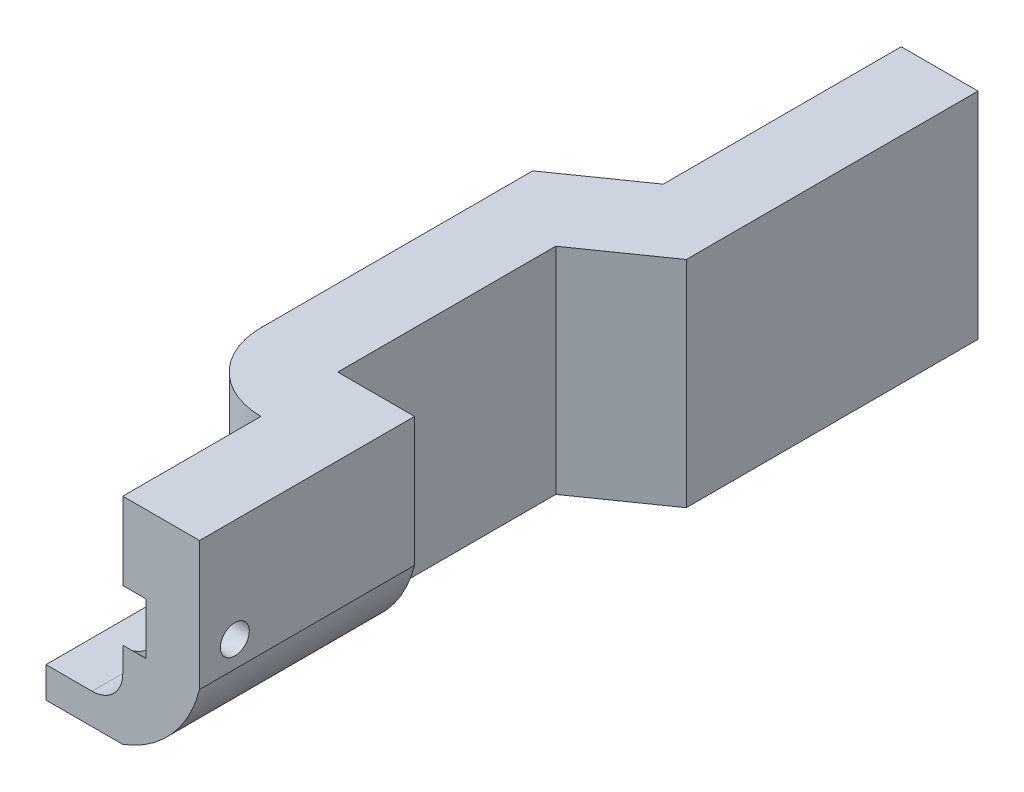
ISO-10303-21;
HEADER;
FILE_DESCRIPTION(('STEP AP214'),'2;1');
FILE_NAME('part.step','',(''),(''),'','','');
FILE_SCHEMA(('AUTOMOTIVE_DESIGN { 1 0 10303 214 1 1 1 1 }'));
ENDSEC;
DATA;
#1=APPLICATION_CONTEXT('core data for automotive mechanical design processes');
#2=APPLICATION_PROTOCOL_DEFINITION('international standard','automotive_design',2000,#1);
#3=PRODUCT_CONTEXT('',#1,'mechanical');
#4=PRODUCT('Part','Part','',(#3));
#5=PRODUCT_RELATED_PRODUCT_CATEGORY('part','',(#4));
#6=PRODUCT_DEFINITION_FORMATION('','',#4);
#7=PRODUCT_DEFINITION_CONTEXT('part definition',#1,'design');
#8=PRODUCT_DEFINITION('design','',#6,#7);
#9=PRODUCT_DEFINITION_SHAPE('','',#8);
#10=(LENGTH_UNIT() NAMED_UNIT(*) SI_UNIT(.MILLI.,.METRE.));
#11=(NAMED_UNIT(*) PLANE_ANGLE_UNIT() SI_UNIT($,.RADIAN.));
#12=(NAMED_UNIT(*) SI_UNIT($,.STERADIAN.) SOLID_ANGLE_UNIT());
#13=UNCERTAINTY_MEASURE_WITH_UNIT(LENGTH_MEASURE(1.E-05),#10,'distance_accuracy_value','');
#14=(GEOMETRIC_REPRESENTATION_CONTEXT(3) GLOBAL_UNCERTAINTY_ASSIGNED_CONTEXT((#13)) GLOBAL_UNIT_ASSIGNED_CONTEXT((#10,
#11,#12)) REPRESENTATION_CONTEXT('',''));
#15=CARTESIAN_POINT('',(0.,0.,0.));
#16=DIRECTION('',(0.,0.,1.));
#17=DIRECTION('',(1.,0.,0.));
#18=AXIS2_PLACEMENT_3D('',#15,#16,#17);
#19=CARTESIAN_POINT('',(5.,14.,0.));
#20=DIRECTION('',(-1.,0.,0.));
#21=DIRECTION('',(0.,0.,1.));
#22=AXIS2_PLACEMENT_3D('',#19,#20,#21);
#23=PLANE('',#22);
#24=DIRECTION('',(0.,1.,0.));
#25=VECTOR('',#24,1.);
#26=CARTESIAN_POINT('',(5.,14.,-5.));
#27=LINE('',#26,#25);
#28=CARTESIAN_POINT('',(5.,0.,-5.));
#29=VERTEX_POINT('',#28);
#30=CARTESIAN_POINT('',(5.,14.,-5.));
#31=VERTEX_POINT('',#30);
#32=EDGE_CURVE('E197',#29,#31,#27,.T.);
#33=ORIENTED_EDGE('',*,*,#32,.F.);
#34=DIRECTION('',(0.,0.,-1.));
#35=VECTOR('',#34,1.);
#36=CARTESIAN_POINT('',(5.,0.,0.));
#37=LINE('',#36,#35);
#38=CARTESIAN_POINT('',(5.,0.,-19.2));
#39=VERTEX_POINT('',#38);
#40=EDGE_CURVE('E173',#29,#39,#37,.T.);
#41=ORIENTED_EDGE('',*,*,#40,.T.);
#42=DIRECTION('',(0.,-1.,0.));
#43=VECTOR('',#42,1.);
#44=CARTESIAN_POINT('',(5.,14.,-19.2));
#45=LINE('',#44,#43);
#46=CARTESIAN_POINT('',(5.,14.,-19.2));
#47=VERTEX_POINT('',#46);
#48=EDGE_CURVE('E247',#47,#39,#45,.T.);
#49=ORIENTED_EDGE('',*,*,#48,.F.);
#50=DIRECTION('',(0.,0.,-1.));
#51=VECTOR('',#50,1.);
#52=CARTESIAN_POINT('',(5.,14.,0.));
#53=LINE('',#52,#51);
#54=EDGE_CURVE('E208',#31,#47,#53,.T.);
#55=ORIENTED_EDGE('',*,*,#54,.F.);
#56=EDGE_LOOP('',(#33,#41,#49,#55));
#57=FACE_BOUND('',#56,.T.);
#58=ADVANCED_FACE('F41',(#57),#23,.F.);
#59=CARTESIAN_POINT('',(0.,14.,0.));
#60=DIRECTION('',(1.,0.,0.));
#61=DIRECTION('',(0.,0.,-1.));
#62=AXIS2_PLACEMENT_3D('',#59,#60,#61);
#63=PLANE('',#62);
#64=DIRECTION('',(0.,0.,1.));
#65=VECTOR('',#64,1.);
#66=CARTESIAN_POINT('',(0.,2.,-5.));
#67=LINE('',#66,#65);
#68=CARTESIAN_POINT('',(0.,2.,-5.));
#69=VERTEX_POINT('',#68);
#70=CARTESIAN_POINT('',(0.,2.,9.));
#71=VERTEX_POINT('',#70);
#72=EDGE_CURVE('E194',#69,#71,#67,.T.);
#73=ORIENTED_EDGE('',*,*,#72,.F.);
#74=DIRECTION('',(0.,-1.,0.));
#75=VECTOR('',#74,1.);
#76=CARTESIAN_POINT('',(0.,14.,-5.));
#77=LINE('',#76,#75);
#78=CARTESIAN_POINT('',(0.,14.,-5.));
#79=VERTEX_POINT('',#78);
#80=EDGE_CURVE('E261',#69,#79,#77,.F.);
#81=ORIENTED_EDGE('',*,*,#80,.T.);
#82=DIRECTION('',(0.,0.,1.));
#83=VECTOR('',#82,1.);
#84=CARTESIAN_POINT('',(0.,14.,0.));
#85=LINE('',#84,#83);
#86=CARTESIAN_POINT('',(0.,14.,-22.7));
#87=VERTEX_POINT('',#86);
#88=EDGE_CURVE('E205',#87,#79,#85,.T.);
#89=ORIENTED_EDGE('',*,*,#88,.F.);
#90=DIRECTION('',(0.,-1.,0.));
#91=VECTOR('',#90,1.);
#92=CARTESIAN_POINT('',(0.,14.,-22.7));
#93=LINE('',#92,#91);
#94=CARTESIAN_POINT('',(0.,0.,-22.7));
#95=VERTEX_POINT('',#94);
#96=EDGE_CURVE('E221',#87,#95,#93,.T.);
#97=ORIENTED_EDGE('',*,*,#96,.T.);
#98=DIRECTION('',(0.,0.,1.));
#99=VECTOR('',#98,1.);
#100=CARTESIAN_POINT('',(0.,0.,0.));
#101=LINE('',#100,#99);
#102=CARTESIAN_POINT('',(0.,0.,9.));
#103=VERTEX_POINT('',#102);
#104=EDGE_CURVE('E204',#95,#103,#101,.T.);
#105=ORIENTED_EDGE('',*,*,#104,.T.);
#106=DIRECTION('',(0.,-1.,0.));
#107=VECTOR('',#106,1.);
#108=CARTESIAN_POINT('',(0.,0.,9.));
#109=LINE('',#108,#107);
#110=EDGE_CURVE('E178',#71,#103,#109,.T.);
#111=ORIENTED_EDGE('',*,*,#110,.F.);
#112=EDGE_LOOP('',(#73,#81,#89,#97,#105,#111));
#113=FACE_BOUND('',#112,.T.);
#114=ADVANCED_FACE('F280',(#113),#63,.F.);
#115=CARTESIAN_POINT('',(10.,14.,-22.7));
#116=DIRECTION('',(-0.573462344363329,0.,-0.81923192051904));
#117=DIRECTION('',(-0.81923192051904,0.,0.573462344363329));
#118=AXIS2_PLACEMENT_3D('',#115,#116,#117);
#119=PLANE('',#118);
#120=DIRECTION('',(0.81923192051904,0.,-0.573462344363329));
#121=VECTOR('',#120,1.);
#122=CARTESIAN_POINT('',(10.,0.,-22.7));
#123=LINE('',#122,#121);
#124=CARTESIAN_POINT('',(10.,0.,-22.7));
#125=VERTEX_POINT('',#124);
#126=EDGE_CURVE('E224',#39,#125,#123,.T.);
#127=ORIENTED_EDGE('',*,*,#126,.T.);
#128=DIRECTION('',(0.,-1.,0.));
#129=VECTOR('',#128,1.);
#130=CARTESIAN_POINT('',(10.,14.,-22.7));
#131=LINE('',#130,#129);
#132=CARTESIAN_POINT('',(10.,14.,-22.7));
#133=VERTEX_POINT('',#132);
#134=EDGE_CURVE('E244',#133,#125,#131,.T.);
#135=ORIENTED_EDGE('',*,*,#134,.F.);
#136=DIRECTION('',(0.81923192051904,0.,-0.573462344363329));
#137=VECTOR('',#136,1.);
#138=CARTESIAN_POINT('',(10.,14.,-22.7));
#139=LINE('',#138,#137);
#140=EDGE_CURVE('E211',#47,#133,#139,.T.);
#141=ORIENTED_EDGE('',*,*,#140,.F.);
#142=ORIENTED_EDGE('',*,*,#48,.T.);
#143=EDGE_LOOP('',(#127,#135,#141,#142));
#144=FACE_BOUND('',#143,.T.);
#145=ADVANCED_FACE('F283',(#144),#119,.F.);
#146=CARTESIAN_POINT('',(10.,14.,-41.7));
#147=DIRECTION('',(-1.,0.,0.));
#148=DIRECTION('',(0.,0.,1.));
#149=AXIS2_PLACEMENT_3D('',#146,#147,#148);
#150=PLANE('',#149);
#151=DIRECTION('',(0.,0.,-1.));
#152=VECTOR('',#151,1.);
#153=CARTESIAN_POINT('',(10.,0.,-41.7));
#154=LINE('',#153,#152);
#155=CARTESIAN_POINT('',(10.,0.,-41.7));
#156=VERTEX_POINT('',#155);
#157=EDGE_CURVE('E226',#125,#156,#154,.T.);
#158=ORIENTED_EDGE('',*,*,#157,.T.);
#159=DIRECTION('',(0.,-1.,0.));
#160=VECTOR('',#159,1.);
#161=CARTESIAN_POINT('',(10.,14.,-41.7));
#162=LINE('',#161,#160);
#163=CARTESIAN_POINT('',(10.,14.,-41.7));
#164=VERTEX_POINT('',#163);
#165=EDGE_CURVE('E241',#164,#156,#162,.T.);
#166=ORIENTED_EDGE('',*,*,#165,.F.);
#167=DIRECTION('',(0.,0.,-1.));
#168=VECTOR('',#167,1.);
#169=CARTESIAN_POINT('',(10.,14.,-41.7));
#170=LINE('',#169,#168);
#171=EDGE_CURVE('E213',#133,#164,#170,.T.);
#172=ORIENTED_EDGE('',*,*,#171,.F.);
#173=ORIENTED_EDGE('',*,*,#134,.T.);
#174=EDGE_LOOP('',(#158,#166,#172,#173));
#175=FACE_BOUND('',#174,.T.);
#176=ADVANCED_FACE('F290',(#175),#150,.F.);
#177=CARTESIAN_POINT('',(5.,14.,-41.7));
#178=DIRECTION('',(0.,0.,1.));
#179=DIRECTION('',(1.,0.,0.));
#180=AXIS2_PLACEMENT_3D('',#177,#178,#179);
#181=PLANE('',#180);
#182=DIRECTION('',(-1.,0.,0.));
#183=VECTOR('',#182,1.);
#184=CARTESIAN_POINT('',(5.,0.,-41.7));
#185=LINE('',#184,#183);
#186=CARTESIAN_POINT('',(5.,0.,-41.7));
#187=VERTEX_POINT('',#186);
#188=EDGE_CURVE('E228',#156,#187,#185,.T.);
#189=ORIENTED_EDGE('',*,*,#188,.T.);
#190=DIRECTION('',(0.,-1.,0.));
#191=VECTOR('',#190,1.);
#192=CARTESIAN_POINT('',(5.,14.,-41.7));
#193=LINE('',#192,#191);
#194=CARTESIAN_POINT('',(5.,14.,-41.7));
#195=VERTEX_POINT('',#194);
#196=EDGE_CURVE('E238',#195,#187,#193,.T.);
#197=ORIENTED_EDGE('',*,*,#196,.F.);
#198=DIRECTION('',(-1.,0.,0.));
#199=VECTOR('',#198,1.);
#200=CARTESIAN_POINT('',(5.,14.,-41.7));
#201=LINE('',#200,#199);
#202=EDGE_CURVE('E215',#164,#195,#201,.T.);
#203=ORIENTED_EDGE('',*,*,#202,.F.);
#204=ORIENTED_EDGE('',*,*,#165,.T.);
#205=EDGE_LOOP('',(#189,#197,#203,#204));
#206=FACE_BOUND('',#205,.T.);
#207=ADVANCED_FACE('F294',(#206),#181,.F.);
#208=CARTESIAN_POINT('',(5.,14.,-26.2));
#209=DIRECTION('',(1.,0.,0.));
#210=DIRECTION('',(0.,0.,-1.));
#211=AXIS2_PLACEMENT_3D('',#208,#209,#210);
#212=PLANE('',#211);
#213=DIRECTION('',(0.,0.,1.));
#214=VECTOR('',#213,1.);
#215=CARTESIAN_POINT('',(5.,0.,-26.2));
#216=LINE('',#215,#214);
#217=CARTESIAN_POINT('',(5.,0.,-26.2));
#218=VERTEX_POINT('',#217);
#219=EDGE_CURVE('E230',#187,#218,#216,.T.);
#220=ORIENTED_EDGE('',*,*,#219,.T.);
#221=DIRECTION('',(0.,-1.,0.));
#222=VECTOR('',#221,1.);
#223=CARTESIAN_POINT('',(5.,14.,-26.2));
#224=LINE('',#223,#222);
#225=CARTESIAN_POINT('',(5.,14.,-26.2));
#226=VERTEX_POINT('',#225);
#227=EDGE_CURVE('E235',#226,#218,#224,.T.);
#228=ORIENTED_EDGE('',*,*,#227,.F.);
#229=DIRECTION('',(0.,0.,1.));
#230=VECTOR('',#229,1.);
#231=CARTESIAN_POINT('',(5.,14.,-26.2));
#232=LINE('',#231,#230);
#233=EDGE_CURVE('E217',#195,#226,#232,.T.);
#234=ORIENTED_EDGE('',*,*,#233,.F.);
#235=ORIENTED_EDGE('',*,*,#196,.T.);
#236=EDGE_LOOP('',(#220,#228,#234,#235));
#237=FACE_BOUND('',#236,.T.);
#238=ADVANCED_FACE('F298',(#237),#212,.F.);
#239=CARTESIAN_POINT('',(5.,14.,-26.2));
#240=DIRECTION('',(0.573462344363329,0.,0.81923192051904));
#241=DIRECTION('',(0.81923192051904,0.,-0.573462344363329));
#242=AXIS2_PLACEMENT_3D('',#239,#240,#241);
#243=PLANE('',#242);
#244=DIRECTION('',(-0.81923192051904,0.,0.573462344363329));
#245=VECTOR('',#244,1.);
#246=CARTESIAN_POINT('',(5.,0.,-26.2));
#247=LINE('',#246,#245);
#248=EDGE_CURVE('E209',#218,#95,#247,.T.);
#249=ORIENTED_EDGE('',*,*,#248,.T.);
#250=ORIENTED_EDGE('',*,*,#96,.F.);
#251=DIRECTION('',(-0.81923192051904,0.,0.573462344363329));
#252=VECTOR('',#251,1.);
#253=CARTESIAN_POINT('',(5.,14.,-26.2));
#254=LINE('',#253,#252);
#255=EDGE_CURVE('E219',#226,#87,#254,.T.);
#256=ORIENTED_EDGE('',*,*,#255,.F.);
#257=ORIENTED_EDGE('',*,*,#227,.T.);
#258=EDGE_LOOP('',(#249,#250,#256,#257));
#259=FACE_BOUND('',#258,.T.);
#260=ADVANCED_FACE('F302',(#259),#243,.F.);
#261=CARTESIAN_POINT('',(0.,14.,0.));
#262=DIRECTION('',(0.,-1.,0.));
#263=DIRECTION('',(0.,0.,-1.));
#264=AXIS2_PLACEMENT_3D('',#261,#262,#263);
#265=PLANE('',#264);
#266=ORIENTED_EDGE('',*,*,#88,.T.);
#267=CARTESIAN_POINT('',(5.,14.,-5.));
#268=DIRECTION('',(0.,-1.,0.));
#269=DIRECTION('',(0.,0.,-1.));
#270=AXIS2_PLACEMENT_3D('',#267,#268,#269);
#271=CIRCLE('',#270,5.);
#272=CARTESIAN_POINT('',(5.,14.,0.));
#273=VERTEX_POINT('',#272);
#274=EDGE_CURVE('E263',#79,#273,#271,.F.);
#275=ORIENTED_EDGE('',*,*,#274,.T.);
#276=DIRECTION('',(0.,0.,1.));
#277=VECTOR('',#276,1.);
#278=CARTESIAN_POINT('',(5.,14.,-5.));
#279=LINE('',#278,#277);
#280=CARTESIAN_POINT('',(5.,14.,9.));
#281=VERTEX_POINT('',#280);
#282=EDGE_CURVE('E195',#273,#281,#279,.T.);
#283=ORIENTED_EDGE('',*,*,#282,.T.);
#284=DIRECTION('',(-1.,0.,0.));
#285=VECTOR('',#284,1.);
#286=CARTESIAN_POINT('',(5.,14.,9.));
#287=LINE('',#286,#285);
#288=CARTESIAN_POINT('',(10.,14.,9.));
#289=VERTEX_POINT('',#288);
#290=EDGE_CURVE('E181',#289,#281,#287,.T.);
#291=ORIENTED_EDGE('',*,*,#290,.F.);
#292=DIRECTION('',(0.,0.,1.));
#293=VECTOR('',#292,1.);
#294=CARTESIAN_POINT('',(10.,14.,-5.));
#295=LINE('',#294,#293);
#296=CARTESIAN_POINT('',(10.,14.,-5.));
#297=VERTEX_POINT('',#296);
#298=EDGE_CURVE('E198',#297,#289,#295,.T.);
#299=ORIENTED_EDGE('',*,*,#298,.F.);
#300=DIRECTION('',(-1.,0.,0.));
#301=VECTOR('',#300,1.);
#302=CARTESIAN_POINT('',(5.,14.,-5.));
#303=LINE('',#302,#301);
#304=EDGE_CURVE('E191',#297,#31,#303,.T.);
#305=ORIENTED_EDGE('',*,*,#304,.T.);
#306=ORIENTED_EDGE('',*,*,#54,.T.);
#307=ORIENTED_EDGE('',*,*,#140,.T.);
#308=ORIENTED_EDGE('',*,*,#171,.T.);
#309=ORIENTED_EDGE('',*,*,#202,.T.);
#310=ORIENTED_EDGE('',*,*,#233,.T.);
#311=ORIENTED_EDGE('',*,*,#255,.T.);
#312=EDGE_LOOP('',(#266,#275,#283,#291,#299,#305,#306,#307,#308,#309,#310,#311));
#313=FACE_BOUND('',#312,.T.);
#314=ADVANCED_FACE('F306',(#313),#265,.F.);
#315=CARTESIAN_POINT('',(0.,0.,0.));
#316=DIRECTION('',(0.,-1.,0.));
#317=DIRECTION('',(0.,0.,-1.));
#318=AXIS2_PLACEMENT_3D('',#315,#316,#317);
#319=PLANE('',#318);
#320=CARTESIAN_POINT('',(7.5,0.,-37.));
#321=DIRECTION('',(0.,-1.,0.));
#322=DIRECTION('',(0.,0.,-1.));
#323=AXIS2_PLACEMENT_3D('',#320,#321,#322);
#324=CIRCLE('',#323,1.);
#325=CARTESIAN_POINT('',(7.5,0.,-38.));
#326=VERTEX_POINT('',#325);
#327=EDGE_CURVE('E374',#326,#326,#324,.T.);
#328=ORIENTED_EDGE('',*,*,#327,.F.);
#329=EDGE_LOOP('',(#328));
#330=FACE_BOUND('',#329,.T.);
#331=CARTESIAN_POINT('',(2.5,0.,-5.1));
#332=DIRECTION('',(0.,-1.,0.));
#333=DIRECTION('',(0.,0.,-1.));
#334=AXIS2_PLACEMENT_3D('',#331,#332,#333);
#335=CIRCLE('',#334,1.);
#336=CARTESIAN_POINT('',(2.5,0.,-6.1));
#337=VERTEX_POINT('',#336);
#338=EDGE_CURVE('E377',#337,#337,#335,.T.);
#339=ORIENTED_EDGE('',*,*,#338,.F.);
#340=EDGE_LOOP('',(#339));
#341=FACE_BOUND('',#340,.T.);
#342=DIRECTION('',(0.,0.,1.));
#343=VECTOR('',#342,1.);
#344=CARTESIAN_POINT('',(5.,0.,-12.));
#345=LINE('',#344,#343);
#346=CARTESIAN_POINT('',(5.,0.,9.));
#347=VERTEX_POINT('',#346);
#348=EDGE_CURVE('E158',#29,#347,#345,.T.);
#349=ORIENTED_EDGE('',*,*,#348,.T.);
#350=DIRECTION('',(1.,0.,0.));
#351=VECTOR('',#350,1.);
#352=CARTESIAN_POINT('',(10.,0.,9.));
#353=LINE('',#352,#351);
#354=EDGE_CURVE('E171',#103,#347,#353,.T.);
#355=ORIENTED_EDGE('',*,*,#354,.F.);
#356=ORIENTED_EDGE('',*,*,#104,.F.);
#357=ORIENTED_EDGE('',*,*,#248,.F.);
#358=ORIENTED_EDGE('',*,*,#219,.F.);
#359=ORIENTED_EDGE('',*,*,#188,.F.);
#360=ORIENTED_EDGE('',*,*,#157,.F.);
#361=ORIENTED_EDGE('',*,*,#126,.F.);
#362=ORIENTED_EDGE('',*,*,#40,.F.);
#363=EDGE_LOOP('',(#349,#355,#356,#357,#358,#359,#360,#361,#362));
#364=FACE_BOUND('',#363,.T.);
#365=ADVANCED_FACE('F169',(#330,#341,#364),#319,.T.);
#366=CARTESIAN_POINT('',(0.,2.,-5.));
#367=DIRECTION('',(0.,1.,0.));
#368=DIRECTION('',(0.,0.,1.));
#369=AXIS2_PLACEMENT_3D('',#366,#367,#368);
#370=PLANE('',#369);
#371=DIRECTION('',(-1.,0.,0.));
#372=VECTOR('',#371,1.);
#373=CARTESIAN_POINT('',(0.,2.,9.));
#374=LINE('',#373,#372);
#375=CARTESIAN_POINT('',(3.,2.,9.));
#376=VERTEX_POINT('',#375);
#377=EDGE_CURVE('E183',#376,#71,#374,.T.);
#378=ORIENTED_EDGE('',*,*,#377,.F.);
#379=DIRECTION('',(0.,0.,1.));
#380=VECTOR('',#379,1.);
#381=CARTESIAN_POINT('',(3.,2.,0.));
#382=LINE('',#381,#380);
#383=CARTESIAN_POINT('',(3.,2.,-0.41742430504416));
#384=VERTEX_POINT('',#383);
#385=EDGE_CURVE('E62',#376,#384,#382,.F.);
#386=ORIENTED_EDGE('',*,*,#385,.T.);
#387=CARTESIAN_POINT('',(5.,2.,-5.));
#388=DIRECTION('',(0.,1.,0.));
#389=DIRECTION('',(0.,0.,1.));
#390=AXIS2_PLACEMENT_3D('',#387,#388,#389);
#391=CIRCLE('',#390,5.);
#392=EDGE_CURVE('E265',#384,#69,#391,.F.);
#393=ORIENTED_EDGE('',*,*,#392,.T.);
#394=ORIENTED_EDGE('',*,*,#72,.T.);
#395=EDGE_LOOP('',(#378,#386,#393,#394));
#396=FACE_BOUND('',#395,.T.);
#397=ADVANCED_FACE('F310',(#396),#370,.T.);
#398=CARTESIAN_POINT('',(5.,14.,-5.));
#399=DIRECTION('',(-1.,0.,0.));
#400=DIRECTION('',(0.,0.,1.));
#401=AXIS2_PLACEMENT_3D('',#398,#399,#400);
#402=PLANE('',#401);
#403=DIRECTION('',(0.,-1.,0.));
#404=VECTOR('',#403,1.);
#405=CARTESIAN_POINT('',(5.,14.,0.));
#406=LINE('',#405,#404);
#407=CARTESIAN_POINT('',(5.,4.,0.));
#408=VERTEX_POINT('',#407);
#409=EDGE_CURVE('E250',#273,#408,#406,.T.);
#410=ORIENTED_EDGE('',*,*,#409,.T.);
#411=DIRECTION('',(0.,0.,1.));
#412=VECTOR('',#411,1.);
#413=CARTESIAN_POINT('',(5.,4.,9.));
#414=LINE('',#413,#412);
#415=CARTESIAN_POINT('',(5.,4.,9.));
#416=VERTEX_POINT('',#415);
#417=EDGE_CURVE('E267',#408,#416,#414,.T.);
#418=ORIENTED_EDGE('',*,*,#417,.T.);
#419=DIRECTION('',(0.,-1.,0.));
#420=VECTOR('',#419,1.);
#421=CARTESIAN_POINT('',(5.,14.,9.));
#422=LINE('',#421,#420);
#423=CARTESIAN_POINT('',(5.,5.59699673202932,9.));
#424=VERTEX_POINT('',#423);
#425=EDGE_CURVE('E389',#424,#416,#422,.T.);
#426=ORIENTED_EDGE('',*,*,#425,.F.);
#427=CARTESIAN_POINT('',(5.,7.28,6.7));
#428=DIRECTION('',(-1.,0.,0.));
#429=DIRECTION('',(0.,0.,1.));
#430=AXIS2_PLACEMENT_3D('',#427,#428,#429);
#431=CIRCLE('',#430,2.85);
#432=CARTESIAN_POINT('',(5.,8.96300326797069,9.));
#433=VERTEX_POINT('',#432);
#434=EDGE_CURVE('E387',#433,#424,#431,.T.);
#435=ORIENTED_EDGE('',*,*,#434,.F.);
#436=EDGE_CURVE('E390',#281,#433,#422,.T.);
#437=ORIENTED_EDGE('',*,*,#436,.F.);
#438=ORIENTED_EDGE('',*,*,#282,.F.);
#439=EDGE_LOOP('',(#410,#418,#426,#435,#437,#438));
#440=FACE_BOUND('',#439,.T.);
#441=ADVANCED_FACE('F315',(#440),#402,.T.);
#442=CARTESIAN_POINT('',(0.,0.,-5.));
#443=DIRECTION('',(0.,0.,1.));
#444=DIRECTION('',(1.,0.,0.));
#445=AXIS2_PLACEMENT_3D('',#442,#443,#444);
#446=PLANE('',#445);
#447=DIRECTION('',(0.,1.,0.));
#448=VECTOR('',#447,1.);
#449=CARTESIAN_POINT('',(10.,14.,-5.));
#450=LINE('',#449,#448);
#451=CARTESIAN_POINT('',(10.,5.59699673202932,-5.));
#452=VERTEX_POINT('',#451);
#453=EDGE_CURVE('E189',#452,#297,#450,.T.);
#454=ORIENTED_EDGE('',*,*,#453,.F.);
#455=CARTESIAN_POINT('',(2.14409225673892,7.5831248359672,-5.));
#456=DIRECTION('',(0.,0.,1.));
#457=DIRECTION('',(1.,0.,0.));
#458=AXIS2_PLACEMENT_3D('',#455,#456,#457);
#459=CIRCLE('',#458,8.10308529610056);
#460=EDGE_CURVE('E382',#452,#29,#459,.F.);
#461=ORIENTED_EDGE('',*,*,#460,.T.);
#462=ORIENTED_EDGE('',*,*,#32,.T.);
#463=ORIENTED_EDGE('',*,*,#304,.F.);
#464=EDGE_LOOP('',(#454,#461,#462,#463));
#465=FACE_BOUND('',#464,.T.);
#466=ADVANCED_FACE('F318',(#465),#446,.F.);
#467=CARTESIAN_POINT('',(10.,14.,-5.));
#468=DIRECTION('',(1.,0.,0.));
#469=DIRECTION('',(0.,0.,-1.));
#470=AXIS2_PLACEMENT_3D('',#467,#468,#469);
#471=PLANE('',#470);
#472=CARTESIAN_POINT('',(10.,7.28,6.7));
#473=DIRECTION('',(-1.,0.,0.));
#474=DIRECTION('',(0.,0.,1.));
#475=AXIS2_PLACEMENT_3D('',#472,#473,#474);
#476=CIRCLE('',#475,0.94);
#477=CARTESIAN_POINT('',(10.,7.28,7.64));
#478=VERTEX_POINT('',#477);
#479=EDGE_CURVE('E364',#478,#478,#476,.T.);
#480=ORIENTED_EDGE('',*,*,#479,.T.);
#481=EDGE_LOOP('',(#480));
#482=FACE_BOUND('',#481,.T.);
#483=DIRECTION('',(0.,0.,1.));
#484=VECTOR('',#483,1.);
#485=CARTESIAN_POINT('',(10.,5.59699673202932,-12.));
#486=LINE('',#485,#484);
#487=CARTESIAN_POINT('',(10.,5.59699673202932,9.));
#488=VERTEX_POINT('',#487);
#489=EDGE_CURVE('E161',#452,#488,#486,.T.);
#490=ORIENTED_EDGE('',*,*,#489,.F.);
#491=ORIENTED_EDGE('',*,*,#453,.T.);
#492=ORIENTED_EDGE('',*,*,#298,.T.);
#493=DIRECTION('',(0.,1.,0.));
#494=VECTOR('',#493,1.);
#495=CARTESIAN_POINT('',(10.,14.,9.));
#496=LINE('',#495,#494);
#497=EDGE_CURVE('E179',#488,#289,#496,.T.);
#498=ORIENTED_EDGE('',*,*,#497,.F.);
#499=EDGE_LOOP('',(#490,#491,#492,#498));
#500=FACE_BOUND('',#499,.T.);
#501=ADVANCED_FACE('F322',(#482,#500),#471,.T.);
#502=CARTESIAN_POINT('',(0.,0.,9.));
#503=DIRECTION('',(0.,0.,1.));
#504=DIRECTION('',(1.,0.,0.));
#505=AXIS2_PLACEMENT_3D('',#502,#503,#504);
#506=PLANE('',#505);
#507=CARTESIAN_POINT('',(2.14409225673892,7.5831248359672,9.));
#508=DIRECTION('',(0.,0.,-1.));
#509=DIRECTION('',(1.,0.,0.));
#510=AXIS2_PLACEMENT_3D('',#507,#508,#509);
#511=CIRCLE('',#510,8.10308529610056);
#512=EDGE_CURVE('E155',#488,#347,#511,.T.);
#513=ORIENTED_EDGE('',*,*,#512,.F.);
#514=ORIENTED_EDGE('',*,*,#497,.T.);
#515=ORIENTED_EDGE('',*,*,#290,.T.);
#516=ORIENTED_EDGE('',*,*,#436,.T.);
#517=DIRECTION('',(-1.,0.,0.));
#518=VECTOR('',#517,1.);
#519=CARTESIAN_POINT('',(6.5,8.96300326797069,9.));
#520=LINE('',#519,#518);
#521=CARTESIAN_POINT('',(6.5,8.96300326797069,9.));
#522=VERTEX_POINT('',#521);
#523=EDGE_CURVE('E259',#522,#433,#520,.T.);
#524=ORIENTED_EDGE('',*,*,#523,.F.);
#525=DIRECTION('',(0.,-1.,0.));
#526=VECTOR('',#525,1.);
#527=CARTESIAN_POINT('',(6.5,0.,9.));
#528=LINE('',#527,#526);
#529=CARTESIAN_POINT('',(6.5,5.59699673202932,9.));
#530=VERTEX_POINT('',#529);
#531=EDGE_CURVE('E253',#522,#530,#528,.T.);
#532=ORIENTED_EDGE('',*,*,#531,.T.);
#533=DIRECTION('',(-1.,0.,0.));
#534=VECTOR('',#533,1.);
#535=CARTESIAN_POINT('',(6.5,5.59699673202932,9.));
#536=LINE('',#535,#534);
#537=EDGE_CURVE('E256',#424,#530,#536,.F.);
#538=ORIENTED_EDGE('',*,*,#537,.F.);
#539=ORIENTED_EDGE('',*,*,#425,.T.);
#540=CARTESIAN_POINT('',(3.,4.,9.));
#541=DIRECTION('',(0.,0.,1.));
#542=DIRECTION('',(1.,0.,0.));
#543=AXIS2_PLACEMENT_3D('',#540,#541,#542);
#544=CIRCLE('',#543,2.);
#545=EDGE_CURVE('E11',#416,#376,#544,.F.);
#546=ORIENTED_EDGE('',*,*,#545,.T.);
#547=ORIENTED_EDGE('',*,*,#377,.T.);
#548=ORIENTED_EDGE('',*,*,#110,.T.);
#549=ORIENTED_EDGE('',*,*,#354,.T.);
#550=EDGE_LOOP('',(#513,#514,#515,#516,#524,#532,#538,#539,#546,#547,#548,#549));
#551=FACE_BOUND('',#550,.T.);
#552=ADVANCED_FACE('F176',(#551),#506,.T.);
#553=CARTESIAN_POINT('',(6.5,7.28,6.7));
#554=DIRECTION('',(-1.,0.,0.));
#555=DIRECTION('',(0.,0.,1.));
#556=AXIS2_PLACEMENT_3D('',#553,#554,#555);
#557=CYLINDRICAL_SURFACE('',#556,2.85);
#558=ORIENTED_EDGE('',*,*,#523,.T.);
#559=ORIENTED_EDGE('',*,*,#434,.T.);
#560=ORIENTED_EDGE('',*,*,#537,.T.);
#561=CARTESIAN_POINT('',(6.5,7.28,6.7));
#562=DIRECTION('',(-1.,0.,0.));
#563=DIRECTION('',(0.,0.,1.));
#564=AXIS2_PLACEMENT_3D('',#561,#562,#563);
#565=CIRCLE('',#564,2.85);
#566=EDGE_CURVE('E385',#522,#530,#565,.T.);
#567=ORIENTED_EDGE('',*,*,#566,.F.);
#568=EDGE_LOOP('',(#558,#559,#560,#567));
#569=FACE_BOUND('',#568,.T.);
#570=ADVANCED_FACE('F331',(#569),#557,.F.);
#571=CARTESIAN_POINT('',(6.5,7.28,6.7));
#572=DIRECTION('',(-1.,0.,0.));
#573=DIRECTION('',(0.,0.,1.));
#574=AXIS2_PLACEMENT_3D('',#571,#572,#573);
#575=PLANE('',#574);
#576=CARTESIAN_POINT('',(6.5,7.28,6.7));
#577=DIRECTION('',(-1.,0.,0.));
#578=DIRECTION('',(0.,0.,1.));
#579=AXIS2_PLACEMENT_3D('',#576,#577,#578);
#580=CIRCLE('',#579,0.94);
#581=CARTESIAN_POINT('',(6.5,7.28,7.64));
#582=VERTEX_POINT('',#581);
#583=EDGE_CURVE('E367',#582,#582,#580,.T.);
#584=ORIENTED_EDGE('',*,*,#583,.F.);
#585=EDGE_LOOP('',(#584));
#586=FACE_BOUND('',#585,.T.);
#587=ORIENTED_EDGE('',*,*,#566,.T.);
#588=ORIENTED_EDGE('',*,*,#531,.F.);
#589=EDGE_LOOP('',(#587,#588));
#590=FACE_BOUND('',#589,.T.);
#591=ADVANCED_FACE('F334',(#586,#590),#575,.T.);
#592=CARTESIAN_POINT('',(2.14409225673892,7.5831248359672,-12.));
#593=DIRECTION('',(0.,0.,1.));
#594=DIRECTION('',(1.,0.,0.));
#595=AXIS2_PLACEMENT_3D('',#592,#593,#594);
#596=CYLINDRICAL_SURFACE('',#595,8.10308529610056);
#597=ORIENTED_EDGE('',*,*,#489,.T.);
#598=ORIENTED_EDGE('',*,*,#512,.T.);
#599=ORIENTED_EDGE('',*,*,#348,.F.);
#600=ORIENTED_EDGE('',*,*,#460,.F.);
#601=EDGE_LOOP('',(#597,#598,#599,#600));
#602=FACE_BOUND('',#601,.T.);
#603=ADVANCED_FACE('F157',(#602),#596,.T.);
#604=CARTESIAN_POINT('',(2.5,5.,-5.1));
#605=DIRECTION('',(0.,-1.,0.));
#606=DIRECTION('',(0.,0.,-1.));
#607=AXIS2_PLACEMENT_3D('',#604,#605,#606);
#608=CYLINDRICAL_SURFACE('',#607,1.);
#609=CARTESIAN_POINT('',(2.5,5.,-5.1));
#610=DIRECTION('',(0.,-1.,0.));
#611=DIRECTION('',(0.,0.,-1.));
#612=AXIS2_PLACEMENT_3D('',#609,#610,#611);
#613=CIRCLE('',#612,1.);
#614=CARTESIAN_POINT('',(2.5,5.,-6.1));
#615=VERTEX_POINT('',#614);
#616=EDGE_CURVE('E369',#615,#615,#613,.T.);
#617=ORIENTED_EDGE('',*,*,#616,.F.);
#618=EDGE_LOOP('',(#617));
#619=FACE_BOUND('',#618,.T.);
#620=ORIENTED_EDGE('',*,*,#338,.T.);
#621=EDGE_LOOP('',(#620));
#622=FACE_BOUND('',#621,.T.);
#623=ADVANCED_FACE('F341',(#619,#622),#608,.F.);
#624=CARTESIAN_POINT('',(2.5,5.,-5.1));
#625=DIRECTION('',(0.,-1.,0.));
#626=DIRECTION('',(0.,0.,-1.));
#627=AXIS2_PLACEMENT_3D('',#624,#625,#626);
#628=PLANE('',#627);
#629=ORIENTED_EDGE('',*,*,#616,.T.);
#630=EDGE_LOOP('',(#629));
#631=FACE_BOUND('',#630,.T.);
#632=ADVANCED_FACE('F342',(#631),#628,.T.);
#633=CARTESIAN_POINT('',(7.5,5.,-37.));
#634=DIRECTION('',(0.,-1.,0.));
#635=DIRECTION('',(0.,0.,-1.));
#636=AXIS2_PLACEMENT_3D('',#633,#634,#635);
#637=CYLINDRICAL_SURFACE('',#636,1.);
#638=CARTESIAN_POINT('',(7.5,5.,-37.));
#639=DIRECTION('',(0.,-1.,0.));
#640=DIRECTION('',(0.,0.,-1.));
#641=AXIS2_PLACEMENT_3D('',#638,#639,#640);
#642=CIRCLE('',#641,1.);
#643=CARTESIAN_POINT('',(7.5,5.,-38.));
#644=VERTEX_POINT('',#643);
#645=EDGE_CURVE('E164',#644,#644,#642,.T.);
#646=ORIENTED_EDGE('',*,*,#645,.F.);
#647=EDGE_LOOP('',(#646));
#648=FACE_BOUND('',#647,.T.);
#649=ORIENTED_EDGE('',*,*,#327,.T.);
#650=EDGE_LOOP('',(#649));
#651=FACE_BOUND('',#650,.T.);
#652=ADVANCED_FACE('F345',(#648,#651),#637,.F.);
#653=CARTESIAN_POINT('',(7.5,5.,-37.));
#654=DIRECTION('',(0.,-1.,0.));
#655=DIRECTION('',(0.,0.,-1.));
#656=AXIS2_PLACEMENT_3D('',#653,#654,#655);
#657=PLANE('',#656);
#658=ORIENTED_EDGE('',*,*,#645,.T.);
#659=EDGE_LOOP('',(#658));
#660=FACE_BOUND('',#659,.T.);
#661=ADVANCED_FACE('F352',(#660),#657,.T.);
#662=CARTESIAN_POINT('',(10.,7.28,6.7));
#663=DIRECTION('',(-1.,0.,0.));
#664=DIRECTION('',(0.,0.,1.));
#665=AXIS2_PLACEMENT_3D('',#662,#663,#664);
#666=CYLINDRICAL_SURFACE('',#665,0.94);
#667=ORIENTED_EDGE('',*,*,#479,.F.);
#668=EDGE_LOOP('',(#667));
#669=FACE_BOUND('',#668,.T.);
#670=ORIENTED_EDGE('',*,*,#583,.T.);
#671=EDGE_LOOP('',(#670));
#672=FACE_BOUND('',#671,.T.);
#673=ADVANCED_FACE('F278',(#669,#672),#666,.F.);
#674=CARTESIAN_POINT('',(5.,14.,-5.));
#675=DIRECTION('',(0.,-1.,0.));
#676=DIRECTION('',(0.,0.,-1.));
#677=AXIS2_PLACEMENT_3D('',#674,#675,#676);
#678=CYLINDRICAL_SURFACE('',#677,5.);
#679=ORIENTED_EDGE('',*,*,#392,.F.);
#680=CARTESIAN_POINT('',(3.,2.,-0.41742430504416));
#681=CARTESIAN_POINT('',(3.05117577030577,1.99999443289013,-0.395081063868308));
#682=CARTESIAN_POINT('',(3.10274067961406,2.00196453574163,-0.373605135241887));
#683=CARTESIAN_POINT('',(3.20630255375353,2.00999179872974,-0.332480827540287));
#684=CARTESIAN_POINT('',(3.25829968896933,2.01605065426075,-0.312833210418417));
#685=CARTESIAN_POINT('',(3.36236385556534,2.03239563053567,-0.275467414654525));
#686=CARTESIAN_POINT('',(3.41443090925868,2.04268395510999,-0.257750248001285));
#687=CARTESIAN_POINT('',(3.51815767368078,2.06755017360238,-0.224319977292748));
#688=CARTESIAN_POINT('',(3.56981744773324,2.08212738661972,-0.20860655569156));
#689=CARTESIAN_POINT('',(3.72384042192591,2.13246024568375,-0.164424871462815));
#690=CARTESIAN_POINT('',(3.82503529381971,2.17478486935207,-0.138990373151942));
#691=CARTESIAN_POINT('',(4.02020686431291,2.27626016371923,-0.0959177905977656));
#692=CARTESIAN_POINT('',(4.11419087391561,2.33539349815387,-0.078271721102065));
#693=CARTESIAN_POINT('',(4.28816669368648,2.46637305337526,-0.0501757046494365));
#694=CARTESIAN_POINT('',(4.36856358808598,2.53762741093617,-0.0394698978703132));
#695=CARTESIAN_POINT('',(4.5171500873473,2.6924165262334,-0.0228057144555873));
#696=CARTESIAN_POINT('',(4.58533369796703,2.77595727766528,-0.0168496640624771));
#697=CARTESIAN_POINT('',(4.70828058133032,2.95421736178685,-0.00813052554756326));
#698=CARTESIAN_POINT('',(4.76284891642379,3.04907316057462,-0.00541192157019465));
#699=CARTESIAN_POINT('',(4.85580259757658,3.24641482110553,-0.00186205761421346));
#700=CARTESIAN_POINT('',(4.89419120250744,3.34889914143768,-0.00103041742108974));
#701=CARTESIAN_POINT('',(4.94916831790033,3.54255689455645,-0.000195337061951861));
#702=CARTESIAN_POINT('',(4.96820502575629,3.63303882577316,-8.39965648111286E-05));
#703=CARTESIAN_POINT('',(4.98726689057845,3.77000281486723,-1.26493154254239E-05));
#704=CARTESIAN_POINT('',(4.992038645888,3.81586407352841,-4.81059727142297E-06));
#705=CARTESIAN_POINT('',(4.99840561158743,3.9078125147172,2.44969162173675E-07));
#706=CARTESIAN_POINT('',(5.00000041254779,3.95389972559723,-2.53955149181121E-06));
#707=CARTESIAN_POINT('',(5.,4.,0.));
#708=B_SPLINE_CURVE_WITH_KNOTS('',3,(#680,#681,#682,#683,#684,#685,#686,#687,#688,#689,#690,
#691,#692,#693,#694,#695,#696,#697,#698,#699,#700,#701,#702,#703,#704,#705,#706,#707),
.UNSPECIFIED.,.F.,.F.,(4,2,2,2,2,2,2,2,2,2,2,2,2,4),(0.,0.167492523155857,0.335054539512392,
0.502703977545897,0.670326814028302,1.00624515695024,1.34181828783691,1.66418569312858,
1.98671088440652,2.31361840235485,2.64046004409222,2.91692195256549,3.05515140156105,
3.19339866370467),.UNSPECIFIED.);
#709=EDGE_CURVE('E50',#384,#408,#708,.T.);
#710=ORIENTED_EDGE('',*,*,#709,.T.);
#711=ORIENTED_EDGE('',*,*,#409,.F.);
#712=ORIENTED_EDGE('',*,*,#274,.F.);
#713=ORIENTED_EDGE('',*,*,#80,.F.);
#714=EDGE_LOOP('',(#679,#710,#711,#712,#713));
#715=FACE_BOUND('',#714,.T.);
#716=ADVANCED_FACE('F274',(#715),#678,.T.);
#717=CARTESIAN_POINT('',(3.,4.,-5.));
#718=DIRECTION('',(0.,0.,-1.));
#719=DIRECTION('',(-1.,0.,0.));
#720=AXIS2_PLACEMENT_3D('',#717,#718,#719);
#721=CYLINDRICAL_SURFACE('',#720,2.);
#722=ORIENTED_EDGE('',*,*,#709,.F.);
#723=ORIENTED_EDGE('',*,*,#385,.F.);
#724=ORIENTED_EDGE('',*,*,#545,.F.);
#725=ORIENTED_EDGE('',*,*,#417,.F.);
#726=EDGE_LOOP('',(#722,#723,#724,#725));
#727=FACE_BOUND('',#726,.T.);
#728=ADVANCED_FACE('F43',(#727),#721,.F.);
#729=CLOSED_SHELL('',(#58,#114,#145,#176,#207,#238,#260,#314,#365,#397,#441,#466,#501,#552,#570,
#591,#603,#623,#632,#652,#661,#673,#716,#728));
#730=MANIFOLD_SOLID_BREP('B2',#729);
#731=ADVANCED_BREP_SHAPE_REPRESENTATION('',(#18,#730),#14);
#732=SHAPE_DEFINITION_REPRESENTATION(#9,#731);
ENDSEC;
END-ISO-10303-21;
